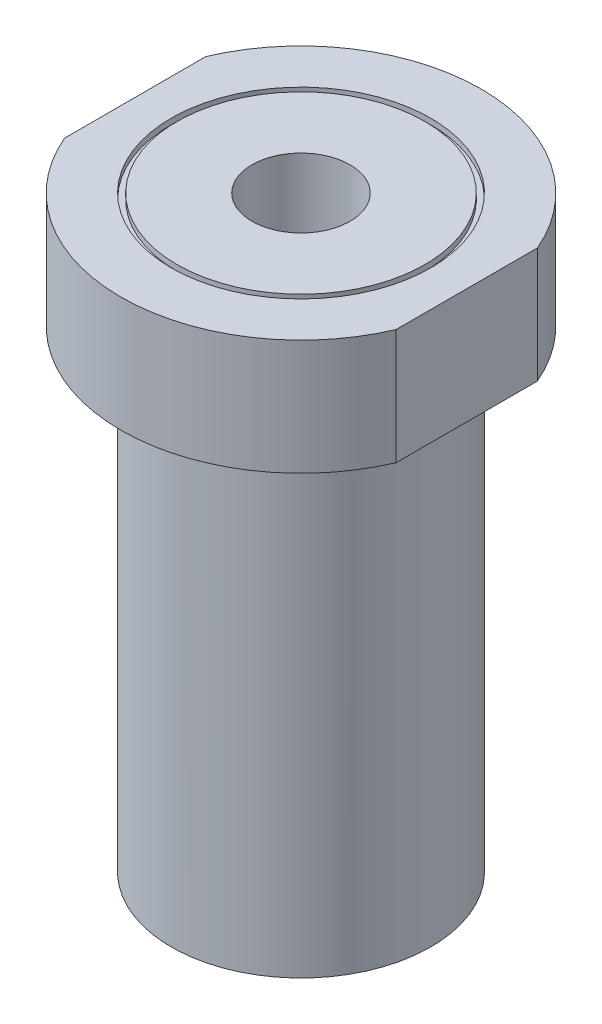
ISO-10303-21;
HEADER;
FILE_DESCRIPTION(('STEP AP214'),'2;1');
FILE_NAME('part.step','',(''),(''),'','','');
FILE_SCHEMA(('AUTOMOTIVE_DESIGN { 1 0 10303 214 1 1 1 1 }'));
ENDSEC;
DATA;
#1=APPLICATION_CONTEXT('core data for automotive mechanical design processes');
#2=APPLICATION_PROTOCOL_DEFINITION('international standard','automotive_design',2000,#1);
#3=PRODUCT_CONTEXT('',#1,'mechanical');
#4=PRODUCT('Part','Part','',(#3));
#5=PRODUCT_RELATED_PRODUCT_CATEGORY('part','',(#4));
#6=PRODUCT_DEFINITION_FORMATION('','',#4);
#7=PRODUCT_DEFINITION_CONTEXT('part definition',#1,'design');
#8=PRODUCT_DEFINITION('design','',#6,#7);
#9=PRODUCT_DEFINITION_SHAPE('','',#8);
#10=(LENGTH_UNIT() NAMED_UNIT(*) SI_UNIT(.MILLI.,.METRE.));
#11=(NAMED_UNIT(*) PLANE_ANGLE_UNIT() SI_UNIT($,.RADIAN.));
#12=(NAMED_UNIT(*) SI_UNIT($,.STERADIAN.) SOLID_ANGLE_UNIT());
#13=UNCERTAINTY_MEASURE_WITH_UNIT(LENGTH_MEASURE(1.E-05),#10,'distance_accuracy_value','');
#14=(GEOMETRIC_REPRESENTATION_CONTEXT(3) GLOBAL_UNCERTAINTY_ASSIGNED_CONTEXT((#13)) GLOBAL_UNIT_ASSIGNED_CONTEXT((#10,
#11,#12)) REPRESENTATION_CONTEXT('',''));
#15=CARTESIAN_POINT('',(0.,0.,0.));
#16=DIRECTION('',(0.,0.,1.));
#17=DIRECTION('',(1.,0.,0.));
#18=AXIS2_PLACEMENT_3D('',#15,#16,#17);
#19=CARTESIAN_POINT('',(0.,20.4,6.25));
#20=DIRECTION('',(0.,-1.,0.));
#21=DIRECTION('',(0.,0.,-1.));
#22=AXIS2_PLACEMENT_3D('',#19,#20,#21);
#23=PLANE('',#22);
#24=CARTESIAN_POINT('',(0.,20.4,0.));
#25=DIRECTION('',(0.,-1.,0.));
#26=DIRECTION('',(0.,0.,-1.));
#27=AXIS2_PLACEMENT_3D('',#24,#25,#26);
#28=CIRCLE('',#27,1.7);
#29=CARTESIAN_POINT('',(0.,20.4,-1.7));
#30=VERTEX_POINT('',#29);
#31=EDGE_CURVE('E112',#30,#30,#28,.T.);
#32=ORIENTED_EDGE('',*,*,#31,.T.);
#33=EDGE_LOOP('',(#32));
#34=FACE_BOUND('',#33,.T.);
#35=CARTESIAN_POINT('',(0.,20.4,0.));
#36=DIRECTION('',(0.,1.,0.));
#37=DIRECTION('',(0.,0.,1.));
#38=AXIS2_PLACEMENT_3D('',#35,#36,#37);
#39=CIRCLE('',#38,4.3);
#40=CARTESIAN_POINT('',(0.,20.4,4.3));
#41=VERTEX_POINT('',#40);
#42=EDGE_CURVE('E221',#41,#41,#39,.T.);
#43=ORIENTED_EDGE('',*,*,#42,.T.);
#44=EDGE_LOOP('',(#43));
#45=FACE_BOUND('',#44,.T.);
#46=ADVANCED_FACE('F43',(#34,#45),#23,.F.);
#47=CARTESIAN_POINT('',(0.,0.,0.));
#48=DIRECTION('',(0.,-1.,0.));
#49=DIRECTION('',(0.,0.,-1.));
#50=AXIS2_PLACEMENT_3D('',#47,#48,#49);
#51=CYLINDRICAL_SURFACE('',#50,6.25);
#52=CARTESIAN_POINT('',(0.,20.4,0.));
#53=DIRECTION('',(0.,-1.,0.));
#54=DIRECTION('',(0.,0.,-1.));
#55=AXIS2_PLACEMENT_3D('',#52,#53,#54);
#56=CIRCLE('',#55,6.25);
#57=CARTESIAN_POINT('',(5.75,20.4,2.44948974278319));
#58=VERTEX_POINT('',#57);
#59=CARTESIAN_POINT('',(-5.75,20.4,2.44948974278319));
#60=VERTEX_POINT('',#59);
#61=EDGE_CURVE('E98',#58,#60,#56,.T.);
#62=ORIENTED_EDGE('',*,*,#61,.T.);
#63=DIRECTION('',(0.,1.,0.));
#64=VECTOR('',#63,1.);
#65=CARTESIAN_POINT('',(-5.75,-0.001000000000001,2.44948974278319));
#66=LINE('',#65,#64);
#67=CARTESIAN_POINT('',(-5.75,16.4,2.44948974278319));
#68=VERTEX_POINT('',#67);
#69=EDGE_CURVE('E84',#68,#60,#66,.T.);
#70=ORIENTED_EDGE('',*,*,#69,.F.);
#71=CARTESIAN_POINT('',(0.,16.4,0.));
#72=DIRECTION('',(0.,-1.,0.));
#73=DIRECTION('',(0.,0.,-1.));
#74=AXIS2_PLACEMENT_3D('',#71,#72,#73);
#75=CIRCLE('',#74,6.25);
#76=CARTESIAN_POINT('',(5.75,16.4,2.44948974278318));
#77=VERTEX_POINT('',#76);
#78=EDGE_CURVE('E96',#77,#68,#75,.T.);
#79=ORIENTED_EDGE('',*,*,#78,.F.);
#80=DIRECTION('',(0.,1.,0.));
#81=VECTOR('',#80,1.);
#82=CARTESIAN_POINT('',(5.75,-0.001000000000001,2.44948974278319));
#83=LINE('',#82,#81);
#84=EDGE_CURVE('E66',#77,#58,#83,.T.);
#85=ORIENTED_EDGE('',*,*,#84,.T.);
#86=EDGE_LOOP('',(#62,#70,#79,#85));
#87=FACE_BOUND('',#86,.T.);
#88=ADVANCED_FACE('F95',(#87),#51,.T.);
#89=CARTESIAN_POINT('',(0.,15.4,1.7));
#90=DIRECTION('',(0.,1.,0.));
#91=DIRECTION('',(0.,0.,1.));
#92=AXIS2_PLACEMENT_3D('',#89,#90,#91);
#93=PLANE('',#92);
#94=CARTESIAN_POINT('',(0.,15.4,0.));
#95=DIRECTION('',(0.,-1.,0.));
#96=DIRECTION('',(0.,0.,-1.));
#97=AXIS2_PLACEMENT_3D('',#94,#95,#96);
#98=CIRCLE('',#97,1.7);
#99=CARTESIAN_POINT('',(0.,15.4,-1.7));
#100=VERTEX_POINT('',#99);
#101=EDGE_CURVE('E115',#100,#100,#98,.T.);
#102=ORIENTED_EDGE('',*,*,#101,.F.);
#103=EDGE_LOOP('',(#102));
#104=FACE_BOUND('',#103,.T.);
#105=CARTESIAN_POINT('',(0.,15.4,0.));
#106=DIRECTION('',(0.,-1.,0.));
#107=DIRECTION('',(0.,0.,-1.));
#108=AXIS2_PLACEMENT_3D('',#105,#106,#107);
#109=CIRCLE('',#108,3.65);
#110=CARTESIAN_POINT('',(0.,15.4,-3.65));
#111=VERTEX_POINT('',#110);
#112=EDGE_CURVE('E90',#111,#111,#109,.T.);
#113=ORIENTED_EDGE('',*,*,#112,.T.);
#114=EDGE_LOOP('',(#113));
#115=FACE_BOUND('',#114,.T.);
#116=ADVANCED_FACE('F151',(#104,#115),#93,.F.);
#117=CARTESIAN_POINT('',(0.,0.,0.));
#118=DIRECTION('',(0.,-1.,0.));
#119=DIRECTION('',(0.,0.,-1.));
#120=AXIS2_PLACEMENT_3D('',#117,#118,#119);
#121=CYLINDRICAL_SURFACE('',#120,1.7);
#122=ORIENTED_EDGE('',*,*,#31,.F.);
#123=EDGE_LOOP('',(#122));
#124=FACE_BOUND('',#123,.T.);
#125=ORIENTED_EDGE('',*,*,#101,.T.);
#126=EDGE_LOOP('',(#125));
#127=FACE_BOUND('',#126,.T.);
#128=ADVANCED_FACE('F156',(#124,#127),#121,.F.);
#129=CARTESIAN_POINT('',(0.,20.4,0.));
#130=DIRECTION('',(0.,1.,0.));
#131=DIRECTION('',(0.,0.,1.));
#132=AXIS2_PLACEMENT_3D('',#129,#130,#131);
#133=CIRCLE('',#132,4.5);
#134=CARTESIAN_POINT('',(0.,20.4,4.5));
#135=VERTEX_POINT('',#134);
#136=EDGE_CURVE('E168',#135,#135,#133,.T.);
#137=ORIENTED_EDGE('',*,*,#136,.F.);
#138=EDGE_LOOP('',(#137));
#139=FACE_BOUND('',#138,.T.);
#140=CARTESIAN_POINT('',(-5.75,20.4,-2.44948974278319));
#141=VERTEX_POINT('',#140);
#142=CARTESIAN_POINT('',(5.75,20.4,-2.44948974278319));
#143=VERTEX_POINT('',#142);
#144=EDGE_CURVE('E103',#141,#143,#56,.T.);
#145=ORIENTED_EDGE('',*,*,#144,.F.);
#146=DIRECTION('',(0.,0.,-1.));
#147=VECTOR('',#146,1.);
#148=CARTESIAN_POINT('',(-5.75,20.4,-2.44948974278319));
#149=LINE('',#148,#147);
#150=EDGE_CURVE('E99',#60,#141,#149,.T.);
#151=ORIENTED_EDGE('',*,*,#150,.F.);
#152=ORIENTED_EDGE('',*,*,#61,.F.);
#153=DIRECTION('',(0.,0.,1.));
#154=VECTOR('',#153,1.);
#155=CARTESIAN_POINT('',(5.75,20.4,-2.44948974278319));
#156=LINE('',#155,#154);
#157=EDGE_CURVE('E171',#143,#58,#156,.T.);
#158=ORIENTED_EDGE('',*,*,#157,.F.);
#159=EDGE_LOOP('',(#145,#151,#152,#158));
#160=FACE_BOUND('',#159,.T.);
#161=ADVANCED_FACE('F146',(#139,#160),#23,.F.);
#162=CARTESIAN_POINT('',(-5.75,16.4,-2.44948974278319));
#163=VERTEX_POINT('',#162);
#164=CARTESIAN_POINT('',(5.75,16.4,-2.44948974278318));
#165=VERTEX_POINT('',#164);
#166=EDGE_CURVE('E104',#163,#165,#75,.T.);
#167=ORIENTED_EDGE('',*,*,#166,.F.);
#168=DIRECTION('',(0.,1.,0.));
#169=VECTOR('',#168,1.);
#170=CARTESIAN_POINT('',(-5.75,-0.001000000000001,-2.44948974278319));
#171=LINE('',#170,#169);
#172=EDGE_CURVE('E58',#163,#141,#171,.T.);
#173=ORIENTED_EDGE('',*,*,#172,.T.);
#174=ORIENTED_EDGE('',*,*,#144,.T.);
#175=DIRECTION('',(0.,1.,0.));
#176=VECTOR('',#175,1.);
#177=CARTESIAN_POINT('',(5.75,-0.001000000000001,-2.44948974278319));
#178=LINE('',#177,#176);
#179=EDGE_CURVE('E173',#165,#143,#178,.T.);
#180=ORIENTED_EDGE('',*,*,#179,.F.);
#181=EDGE_LOOP('',(#167,#173,#174,#180));
#182=FACE_BOUND('',#181,.T.);
#183=ADVANCED_FACE('F153',(#182),#51,.T.);
#184=CARTESIAN_POINT('',(0.,16.4,4.5));
#185=DIRECTION('',(0.,1.,0.));
#186=DIRECTION('',(0.,0.,1.));
#187=AXIS2_PLACEMENT_3D('',#184,#185,#186);
#188=PLANE('',#187);
#189=CARTESIAN_POINT('',(0.,16.4,0.));
#190=DIRECTION('',(0.,1.,0.));
#191=DIRECTION('',(0.,0.,1.));
#192=AXIS2_PLACEMENT_3D('',#189,#190,#191);
#193=CIRCLE('',#192,5.5);
#194=CARTESIAN_POINT('',(0.,16.4,5.5));
#195=VERTEX_POINT('',#194);
#196=EDGE_CURVE('E11',#195,#195,#193,.T.);
#197=ORIENTED_EDGE('',*,*,#196,.T.);
#198=EDGE_LOOP('',(#197));
#199=FACE_BOUND('',#198,.T.);
#200=ORIENTED_EDGE('',*,*,#78,.T.);
#201=DIRECTION('',(0.,0.,1.));
#202=VECTOR('',#201,1.);
#203=CARTESIAN_POINT('',(-5.75,16.4,-2.44948974278319));
#204=LINE('',#203,#202);
#205=EDGE_CURVE('E81',#163,#68,#204,.T.);
#206=ORIENTED_EDGE('',*,*,#205,.F.);
#207=ORIENTED_EDGE('',*,*,#166,.T.);
#208=DIRECTION('',(0.,0.,-1.));
#209=VECTOR('',#208,1.);
#210=CARTESIAN_POINT('',(5.75,16.4,-2.44948974278319));
#211=LINE('',#210,#209);
#212=EDGE_CURVE('E102',#77,#165,#211,.T.);
#213=ORIENTED_EDGE('',*,*,#212,.F.);
#214=EDGE_LOOP('',(#200,#206,#207,#213));
#215=FACE_BOUND('',#214,.T.);
#216=ADVANCED_FACE('F101',(#199,#215),#188,.F.);
#217=CARTESIAN_POINT('',(0.,0.,0.));
#218=DIRECTION('',(0.,-1.,0.));
#219=DIRECTION('',(0.,0.,-1.));
#220=AXIS2_PLACEMENT_3D('',#217,#218,#219);
#221=CYLINDRICAL_SURFACE('',#220,4.5);
#222=CARTESIAN_POINT('',(0.,15.4,0.));
#223=DIRECTION('',(0.,1.,0.));
#224=DIRECTION('',(0.,0.,1.));
#225=AXIS2_PLACEMENT_3D('',#222,#223,#224);
#226=CIRCLE('',#225,4.5);
#227=CARTESIAN_POINT('',(0.,15.4,4.5));
#228=VERTEX_POINT('',#227);
#229=EDGE_CURVE('E51',#228,#228,#226,.F.);
#230=ORIENTED_EDGE('',*,*,#229,.T.);
#231=EDGE_LOOP('',(#230));
#232=FACE_BOUND('',#231,.T.);
#233=CARTESIAN_POINT('',(0.,0.,0.));
#234=DIRECTION('',(0.,-1.,0.));
#235=DIRECTION('',(0.,0.,-1.));
#236=AXIS2_PLACEMENT_3D('',#233,#234,#235);
#237=CIRCLE('',#236,4.5);
#238=CARTESIAN_POINT('',(0.,0.,-4.5));
#239=VERTEX_POINT('',#238);
#240=EDGE_CURVE('E108',#239,#239,#237,.T.);
#241=ORIENTED_EDGE('',*,*,#240,.F.);
#242=EDGE_LOOP('',(#241));
#243=FACE_BOUND('',#242,.T.);
#244=ADVANCED_FACE('F126',(#232,#243),#221,.T.);
#245=CARTESIAN_POINT('',(0.,0.,3.65));
#246=DIRECTION('',(0.,1.,0.));
#247=DIRECTION('',(0.,0.,1.));
#248=AXIS2_PLACEMENT_3D('',#245,#246,#247);
#249=PLANE('',#248);
#250=CARTESIAN_POINT('',(0.,0.,0.));
#251=DIRECTION('',(0.,1.,0.));
#252=DIRECTION('',(0.,0.,1.));
#253=AXIS2_PLACEMENT_3D('',#250,#251,#252);
#254=CIRCLE('',#253,4.15);
#255=CARTESIAN_POINT('',(0.,0.,4.15));
#256=VERTEX_POINT('',#255);
#257=EDGE_CURVE('E121',#256,#256,#254,.T.);
#258=ORIENTED_EDGE('',*,*,#257,.T.);
#259=EDGE_LOOP('',(#258));
#260=FACE_BOUND('',#259,.T.);
#261=ORIENTED_EDGE('',*,*,#240,.T.);
#262=EDGE_LOOP('',(#261));
#263=FACE_BOUND('',#262,.T.);
#264=ADVANCED_FACE('F188',(#260,#263),#249,.F.);
#265=CARTESIAN_POINT('',(0.,0.,0.));
#266=DIRECTION('',(0.,-1.,0.));
#267=DIRECTION('',(0.,0.,-1.));
#268=AXIS2_PLACEMENT_3D('',#265,#266,#267);
#269=CYLINDRICAL_SURFACE('',#268,3.65);
#270=CARTESIAN_POINT('',(0.,0.500000000000001,0.));
#271=DIRECTION('',(0.,1.,0.));
#272=DIRECTION('',(0.,0.,1.));
#273=AXIS2_PLACEMENT_3D('',#270,#271,#272);
#274=CIRCLE('',#273,3.65);
#275=CARTESIAN_POINT('',(0.,0.500000000000001,3.65));
#276=VERTEX_POINT('',#275);
#277=EDGE_CURVE('E118',#276,#276,#274,.F.);
#278=ORIENTED_EDGE('',*,*,#277,.T.);
#279=EDGE_LOOP('',(#278));
#280=FACE_BOUND('',#279,.T.);
#281=ORIENTED_EDGE('',*,*,#112,.F.);
#282=EDGE_LOOP('',(#281));
#283=FACE_BOUND('',#282,.T.);
#284=ADVANCED_FACE('F140',(#280,#283),#269,.F.);
#285=CARTESIAN_POINT('',(0.,0.500000000000001,0.));
#286=DIRECTION('',(0.,-1.,0.));
#287=DIRECTION('',(0.,0.,-1.));
#288=AXIS2_PLACEMENT_3D('',#285,#286,#287);
#289=CONICAL_SURFACE('',#288,3.65,0.78539816339745);
#290=ORIENTED_EDGE('',*,*,#257,.F.);
#291=EDGE_LOOP('',(#290));
#292=FACE_BOUND('',#291,.T.);
#293=ORIENTED_EDGE('',*,*,#277,.F.);
#294=EDGE_LOOP('',(#293));
#295=FACE_BOUND('',#294,.T.);
#296=ADVANCED_FACE('F131',(#292,#295),#289,.F.);
#297=CARTESIAN_POINT('',(0.,15.4,0.));
#298=DIRECTION('',(0.,1.,0.));
#299=DIRECTION('',(0.,0.,1.));
#300=AXIS2_PLACEMENT_3D('',#297,#298,#299);
#301=TOROIDAL_SURFACE('',#300,5.5,1.);
#302=ORIENTED_EDGE('',*,*,#196,.F.);
#303=EDGE_LOOP('',(#302));
#304=FACE_BOUND('',#303,.T.);
#305=ORIENTED_EDGE('',*,*,#229,.F.);
#306=EDGE_LOOP('',(#305));
#307=FACE_BOUND('',#306,.T.);
#308=ADVANCED_FACE('F45',(#304,#307),#301,.F.);
#309=CARTESIAN_POINT('',(5.75,-0.001000000000001,-2.44948974278319));
#310=DIRECTION('',(-1.,0.,0.));
#311=DIRECTION('',(0.,0.,1.));
#312=AXIS2_PLACEMENT_3D('',#309,#310,#311);
#313=PLANE('',#312);
#314=ORIENTED_EDGE('',*,*,#212,.T.);
#315=ORIENTED_EDGE('',*,*,#179,.T.);
#316=ORIENTED_EDGE('',*,*,#157,.T.);
#317=ORIENTED_EDGE('',*,*,#84,.F.);
#318=EDGE_LOOP('',(#314,#315,#316,#317));
#319=FACE_BOUND('',#318,.T.);
#320=ADVANCED_FACE('F130',(#319),#313,.F.);
#321=CARTESIAN_POINT('',(-5.75,-0.001000000000001,-2.44948974278319));
#322=DIRECTION('',(1.,0.,0.));
#323=DIRECTION('',(0.,0.,-1.));
#324=AXIS2_PLACEMENT_3D('',#321,#322,#323);
#325=PLANE('',#324);
#326=ORIENTED_EDGE('',*,*,#205,.T.);
#327=ORIENTED_EDGE('',*,*,#69,.T.);
#328=ORIENTED_EDGE('',*,*,#150,.T.);
#329=ORIENTED_EDGE('',*,*,#172,.F.);
#330=EDGE_LOOP('',(#326,#327,#328,#329));
#331=FACE_BOUND('',#330,.T.);
#332=ADVANCED_FACE('F83',(#331),#325,.F.);
#333=CARTESIAN_POINT('',(0.,20.2,0.));
#334=DIRECTION('',(0.,1.,0.));
#335=DIRECTION('',(0.,0.,1.));
#336=AXIS2_PLACEMENT_3D('',#333,#334,#335);
#337=CYLINDRICAL_SURFACE('',#336,4.5);
#338=CARTESIAN_POINT('',(0.,20.2,0.));
#339=DIRECTION('',(0.,1.,0.));
#340=DIRECTION('',(0.,0.,1.));
#341=AXIS2_PLACEMENT_3D('',#338,#339,#340);
#342=CIRCLE('',#341,4.5);
#343=CARTESIAN_POINT('',(0.,20.2,4.5));
#344=VERTEX_POINT('',#343);
#345=EDGE_CURVE('E179',#344,#344,#342,.T.);
#346=ORIENTED_EDGE('',*,*,#345,.F.);
#347=EDGE_LOOP('',(#346));
#348=FACE_BOUND('',#347,.T.);
#349=ORIENTED_EDGE('',*,*,#136,.T.);
#350=EDGE_LOOP('',(#349));
#351=FACE_BOUND('',#350,.T.);
#352=ADVANCED_FACE('F203',(#348,#351),#337,.F.);
#353=CARTESIAN_POINT('',(0.,20.2,0.));
#354=DIRECTION('',(0.,1.,0.));
#355=DIRECTION('',(0.,0.,1.));
#356=AXIS2_PLACEMENT_3D('',#353,#354,#355);
#357=PLANE('',#356);
#358=CARTESIAN_POINT('',(0.,20.2,0.));
#359=DIRECTION('',(0.,1.,0.));
#360=DIRECTION('',(0.,0.,1.));
#361=AXIS2_PLACEMENT_3D('',#358,#359,#360);
#362=CIRCLE('',#361,4.3);
#363=CARTESIAN_POINT('',(0.,20.2,4.3));
#364=VERTEX_POINT('',#363);
#365=EDGE_CURVE('E218',#364,#364,#362,.T.);
#366=ORIENTED_EDGE('',*,*,#365,.F.);
#367=EDGE_LOOP('',(#366));
#368=FACE_BOUND('',#367,.T.);
#369=ORIENTED_EDGE('',*,*,#345,.T.);
#370=EDGE_LOOP('',(#369));
#371=FACE_BOUND('',#370,.T.);
#372=ADVANCED_FACE('F205',(#368,#371),#357,.T.);
#373=CARTESIAN_POINT('',(0.,20.2,0.));
#374=DIRECTION('',(0.,1.,0.));
#375=DIRECTION('',(0.,0.,1.));
#376=AXIS2_PLACEMENT_3D('',#373,#374,#375);
#377=CYLINDRICAL_SURFACE('',#376,4.3);
#378=ORIENTED_EDGE('',*,*,#365,.T.);
#379=EDGE_LOOP('',(#378));
#380=FACE_BOUND('',#379,.T.);
#381=ORIENTED_EDGE('',*,*,#42,.F.);
#382=EDGE_LOOP('',(#381));
#383=FACE_BOUND('',#382,.T.);
#384=ADVANCED_FACE('F209',(#380,#383),#377,.T.);
#385=CLOSED_SHELL('',(#46,#88,#116,#128,#161,#183,#216,#244,#264,#284,#296,#308,#320,#332,#352,
#372,#384));
#386=MANIFOLD_SOLID_BREP('B2',#385);
#387=ADVANCED_BREP_SHAPE_REPRESENTATION('',(#18,#386),#14);
#388=SHAPE_DEFINITION_REPRESENTATION(#9,#387);
ENDSEC;
END-ISO-10303-21;
